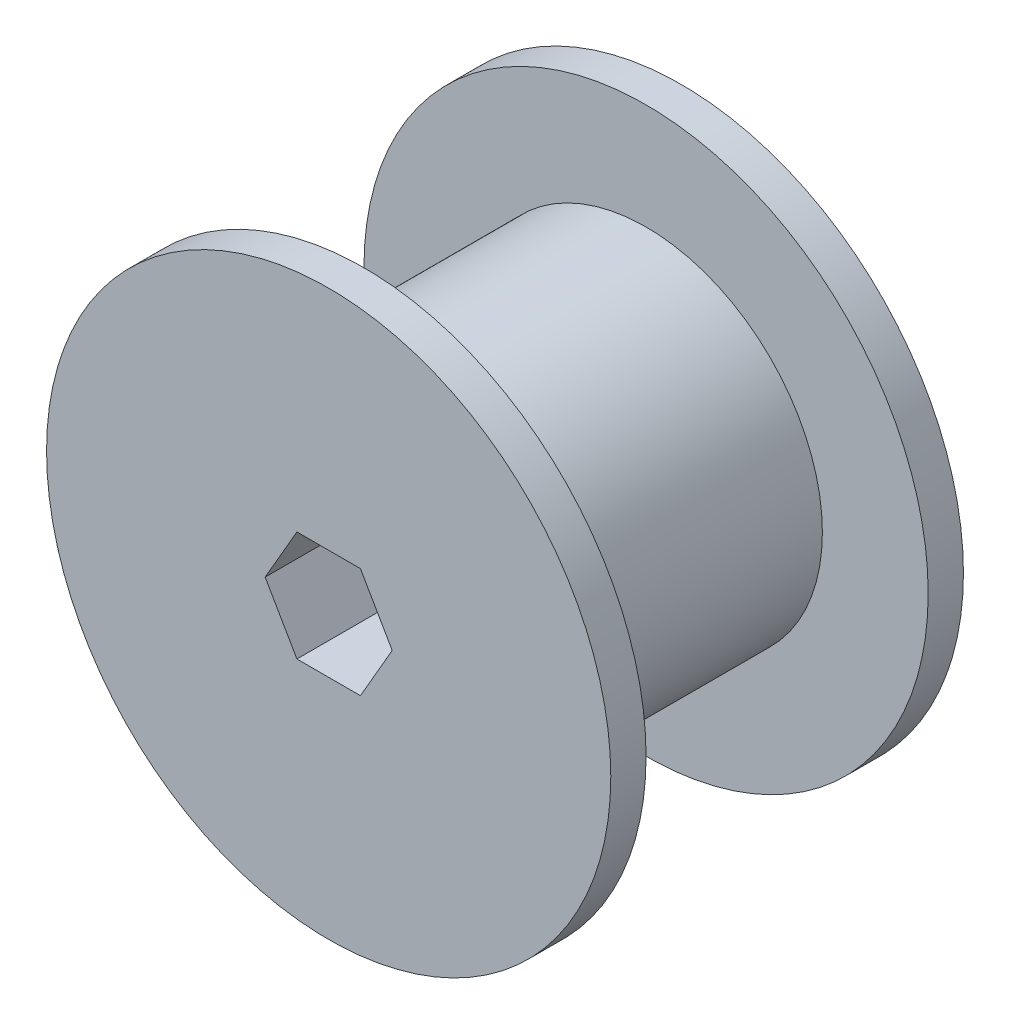
ISO-10303-21;
HEADER;
FILE_DESCRIPTION(('STEP AP214'),'2;1');
FILE_NAME('part.step','',(''),(''),'','','');
FILE_SCHEMA(('AUTOMOTIVE_DESIGN { 1 0 10303 214 1 1 1 1 }'));
ENDSEC;
DATA;
#1=APPLICATION_CONTEXT('core data for automotive mechanical design processes');
#2=APPLICATION_PROTOCOL_DEFINITION('international standard','automotive_design',2000,#1);
#3=PRODUCT_CONTEXT('',#1,'mechanical');
#4=PRODUCT('Part','Part','',(#3));
#5=PRODUCT_RELATED_PRODUCT_CATEGORY('part','',(#4));
#6=PRODUCT_DEFINITION_FORMATION('','',#4);
#7=PRODUCT_DEFINITION_CONTEXT('part definition',#1,'design');
#8=PRODUCT_DEFINITION('design','',#6,#7);
#9=PRODUCT_DEFINITION_SHAPE('','',#8);
#10=(LENGTH_UNIT() NAMED_UNIT(*) SI_UNIT(.MILLI.,.METRE.));
#11=(NAMED_UNIT(*) PLANE_ANGLE_UNIT() SI_UNIT($,.RADIAN.));
#12=(NAMED_UNIT(*) SI_UNIT($,.STERADIAN.) SOLID_ANGLE_UNIT());
#13=UNCERTAINTY_MEASURE_WITH_UNIT(LENGTH_MEASURE(1.E-05),#10,'distance_accuracy_value','');
#14=(GEOMETRIC_REPRESENTATION_CONTEXT(3) GLOBAL_UNCERTAINTY_ASSIGNED_CONTEXT((#13)) GLOBAL_UNIT_ASSIGNED_CONTEXT((#10,
#11,#12)) REPRESENTATION_CONTEXT('',''));
#15=CARTESIAN_POINT('',(0.,0.,0.));
#16=DIRECTION('',(0.,0.,1.));
#17=DIRECTION('',(1.,0.,0.));
#18=AXIS2_PLACEMENT_3D('',#15,#16,#17);
#19=CARTESIAN_POINT('',(0.,0.,12.7));
#20=DIRECTION('',(0.,0.,-1.));
#21=DIRECTION('',(-1.,0.,0.));
#22=AXIS2_PLACEMENT_3D('',#19,#20,#21);
#23=CYLINDRICAL_SURFACE('',#22,15.875);
#24=CARTESIAN_POINT('',(0.,0.,12.7));
#25=DIRECTION('',(0.,0.,1.));
#26=DIRECTION('',(1.,0.,0.));
#27=AXIS2_PLACEMENT_3D('',#24,#25,#26);
#28=CIRCLE('',#27,15.875);
#29=CARTESIAN_POINT('',(15.875,0.,12.7));
#30=VERTEX_POINT('',#29);
#31=EDGE_CURVE('E11',#30,#30,#28,.T.);
#32=ORIENTED_EDGE('',*,*,#31,.F.);
#33=EDGE_LOOP('',(#32));
#34=FACE_BOUND('',#33,.T.);
#35=CARTESIAN_POINT('',(0.,0.,-12.7));
#36=DIRECTION('',(0.,0.,1.));
#37=DIRECTION('',(1.,0.,0.));
#38=AXIS2_PLACEMENT_3D('',#35,#36,#37);
#39=CIRCLE('',#38,15.875);
#40=CARTESIAN_POINT('',(15.875,0.,-12.7));
#41=VERTEX_POINT('',#40);
#42=EDGE_CURVE('E42',#41,#41,#39,.T.);
#43=ORIENTED_EDGE('',*,*,#42,.T.);
#44=EDGE_LOOP('',(#43));
#45=FACE_BOUND('',#44,.T.);
#46=ADVANCED_FACE('F39',(#34,#45),#23,.T.);
#47=CARTESIAN_POINT('',(0.,0.,15.875));
#48=DIRECTION('',(0.,0.,-1.));
#49=DIRECTION('',(-1.,0.,0.));
#50=AXIS2_PLACEMENT_3D('',#47,#48,#49);
#51=CYLINDRICAL_SURFACE('',#50,25.4);
#52=CARTESIAN_POINT('',(0.,0.,15.875));
#53=DIRECTION('',(0.,0.,1.));
#54=DIRECTION('',(1.,0.,0.));
#55=AXIS2_PLACEMENT_3D('',#52,#53,#54);
#56=CIRCLE('',#55,25.4);
#57=CARTESIAN_POINT('',(25.4,0.,15.875));
#58=VERTEX_POINT('',#57);
#59=EDGE_CURVE('E48',#58,#58,#56,.T.);
#60=ORIENTED_EDGE('',*,*,#59,.F.);
#61=EDGE_LOOP('',(#60));
#62=FACE_BOUND('',#61,.T.);
#63=CARTESIAN_POINT('',(0.,0.,12.7));
#64=DIRECTION('',(0.,0.,1.));
#65=DIRECTION('',(1.,0.,0.));
#66=AXIS2_PLACEMENT_3D('',#63,#64,#65);
#67=CIRCLE('',#66,25.4);
#68=CARTESIAN_POINT('',(25.4,0.,12.7));
#69=VERTEX_POINT('',#68);
#70=EDGE_CURVE('E174',#69,#69,#67,.T.);
#71=ORIENTED_EDGE('',*,*,#70,.T.);
#72=EDGE_LOOP('',(#71));
#73=FACE_BOUND('',#72,.T.);
#74=ADVANCED_FACE('F205',(#62,#73),#51,.T.);
#75=CARTESIAN_POINT('',(0.,0.,15.875));
#76=DIRECTION('',(0.,0.,1.));
#77=DIRECTION('',(1.,0.,0.));
#78=AXIS2_PLACEMENT_3D('',#75,#76,#77);
#79=PLANE('',#78);
#80=DIRECTION('',(0.5,0.866025403784439,0.));
#81=VECTOR('',#80,1.);
#82=CARTESIAN_POINT('',(2.85961588329622,-4.953,15.875));
#83=LINE('',#82,#81);
#84=CARTESIAN_POINT('',(2.85961588329622,-4.953,15.875));
#85=VERTEX_POINT('',#84);
#86=CARTESIAN_POINT('',(5.71923176659244,0.,15.875));
#87=VERTEX_POINT('',#86);
#88=EDGE_CURVE('E55',#85,#87,#83,.T.);
#89=ORIENTED_EDGE('',*,*,#88,.F.);
#90=DIRECTION('',(1.,0.,0.));
#91=VECTOR('',#90,1.);
#92=CARTESIAN_POINT('',(-2.85961588329622,-4.953,15.875));
#93=LINE('',#92,#91);
#94=CARTESIAN_POINT('',(-2.85961588329622,-4.953,15.875));
#95=VERTEX_POINT('',#94);
#96=EDGE_CURVE('E115',#95,#85,#93,.T.);
#97=ORIENTED_EDGE('',*,*,#96,.F.);
#98=DIRECTION('',(0.5,-0.866025403784439,0.));
#99=VECTOR('',#98,1.);
#100=CARTESIAN_POINT('',(-5.71923176659244,0.,15.875));
#101=LINE('',#100,#99);
#102=CARTESIAN_POINT('',(-5.71923176659244,0.,15.875));
#103=VERTEX_POINT('',#102);
#104=EDGE_CURVE('E119',#103,#95,#101,.T.);
#105=ORIENTED_EDGE('',*,*,#104,.F.);
#106=DIRECTION('',(-0.5,-0.866025403784439,0.));
#107=VECTOR('',#106,1.);
#108=CARTESIAN_POINT('',(-2.85961588329622,4.953,15.875));
#109=LINE('',#108,#107);
#110=CARTESIAN_POINT('',(-2.85961588329622,4.953,15.875));
#111=VERTEX_POINT('',#110);
#112=EDGE_CURVE('E142',#111,#103,#109,.T.);
#113=ORIENTED_EDGE('',*,*,#112,.F.);
#114=DIRECTION('',(-1.,0.,0.));
#115=VECTOR('',#114,1.);
#116=CARTESIAN_POINT('',(2.85961588329622,4.953,15.875));
#117=LINE('',#116,#115);
#118=CARTESIAN_POINT('',(2.85961588329622,4.953,15.875));
#119=VERTEX_POINT('',#118);
#120=EDGE_CURVE('E138',#119,#111,#117,.T.);
#121=ORIENTED_EDGE('',*,*,#120,.F.);
#122=DIRECTION('',(-0.5,0.866025403784439,0.));
#123=VECTOR('',#122,1.);
#124=CARTESIAN_POINT('',(5.71923176659244,0.,15.875));
#125=LINE('',#124,#123);
#126=EDGE_CURVE('E135',#87,#119,#125,.T.);
#127=ORIENTED_EDGE('',*,*,#126,.F.);
#128=EDGE_LOOP('',(#89,#97,#105,#113,#121,#127));
#129=FACE_BOUND('',#128,.T.);
#130=ORIENTED_EDGE('',*,*,#59,.T.);
#131=EDGE_LOOP('',(#130));
#132=FACE_BOUND('',#131,.T.);
#133=ADVANCED_FACE('F200',(#129,#132),#79,.T.);
#134=CARTESIAN_POINT('',(0.,0.,12.7));
#135=DIRECTION('',(0.,0.,1.));
#136=DIRECTION('',(1.,0.,0.));
#137=AXIS2_PLACEMENT_3D('',#134,#135,#136);
#138=PLANE('',#137);
#139=ORIENTED_EDGE('',*,*,#31,.T.);
#140=EDGE_LOOP('',(#139));
#141=FACE_BOUND('',#140,.T.);
#142=ORIENTED_EDGE('',*,*,#70,.F.);
#143=EDGE_LOOP('',(#142));
#144=FACE_BOUND('',#143,.T.);
#145=ADVANCED_FACE('F192',(#141,#144),#138,.F.);
#146=CARTESIAN_POINT('',(0.,0.,-15.875));
#147=DIRECTION('',(0.,0.,1.));
#148=DIRECTION('',(1.,0.,0.));
#149=AXIS2_PLACEMENT_3D('',#146,#147,#148);
#150=CYLINDRICAL_SURFACE('',#149,25.4);
#151=CARTESIAN_POINT('',(0.,0.,-15.875));
#152=DIRECTION('',(0.,0.,1.));
#153=DIRECTION('',(1.,0.,0.));
#154=AXIS2_PLACEMENT_3D('',#151,#152,#153);
#155=CIRCLE('',#154,25.4);
#156=CARTESIAN_POINT('',(25.4,0.,-15.875));
#157=VERTEX_POINT('',#156);
#158=EDGE_CURVE('E164',#157,#157,#155,.T.);
#159=ORIENTED_EDGE('',*,*,#158,.T.);
#160=EDGE_LOOP('',(#159));
#161=FACE_BOUND('',#160,.T.);
#162=CARTESIAN_POINT('',(0.,0.,-12.7));
#163=DIRECTION('',(0.,0.,1.));
#164=DIRECTION('',(1.,0.,0.));
#165=AXIS2_PLACEMENT_3D('',#162,#163,#164);
#166=CIRCLE('',#165,25.4);
#167=CARTESIAN_POINT('',(25.4,0.,-12.7));
#168=VERTEX_POINT('',#167);
#169=EDGE_CURVE('E152',#168,#168,#166,.T.);
#170=ORIENTED_EDGE('',*,*,#169,.F.);
#171=EDGE_LOOP('',(#170));
#172=FACE_BOUND('',#171,.T.);
#173=ADVANCED_FACE('F190',(#161,#172),#150,.T.);
#174=CARTESIAN_POINT('',(0.,0.,-15.875));
#175=DIRECTION('',(0.,0.,-1.));
#176=DIRECTION('',(1.,0.,0.));
#177=AXIS2_PLACEMENT_3D('',#174,#175,#176);
#178=PLANE('',#177);
#179=DIRECTION('',(0.5,0.866025403784439,0.));
#180=VECTOR('',#179,1.);
#181=CARTESIAN_POINT('',(2.85961588329622,-4.953,-15.875));
#182=LINE('',#181,#180);
#183=CARTESIAN_POINT('',(2.85961588329622,-4.953,-15.875));
#184=VERTEX_POINT('',#183);
#185=CARTESIAN_POINT('',(5.71923176659244,0.,-15.875));
#186=VERTEX_POINT('',#185);
#187=EDGE_CURVE('E95',#184,#186,#182,.T.);
#188=ORIENTED_EDGE('',*,*,#187,.T.);
#189=DIRECTION('',(-0.5,0.866025403784439,0.));
#190=VECTOR('',#189,1.);
#191=CARTESIAN_POINT('',(5.71923176659244,0.,-15.875));
#192=LINE('',#191,#190);
#193=CARTESIAN_POINT('',(2.85961588329622,4.953,-15.875));
#194=VERTEX_POINT('',#193);
#195=EDGE_CURVE('E105',#186,#194,#192,.T.);
#196=ORIENTED_EDGE('',*,*,#195,.T.);
#197=DIRECTION('',(-1.,0.,0.));
#198=VECTOR('',#197,1.);
#199=CARTESIAN_POINT('',(2.85961588329622,4.953,-15.875));
#200=LINE('',#199,#198);
#201=CARTESIAN_POINT('',(-2.85961588329622,4.953,-15.875));
#202=VERTEX_POINT('',#201);
#203=EDGE_CURVE('E63',#194,#202,#200,.T.);
#204=ORIENTED_EDGE('',*,*,#203,.T.);
#205=DIRECTION('',(-0.5,-0.866025403784439,0.));
#206=VECTOR('',#205,1.);
#207=CARTESIAN_POINT('',(-2.85961588329622,4.953,-15.875));
#208=LINE('',#207,#206);
#209=CARTESIAN_POINT('',(-5.71923176659244,0.,-15.875));
#210=VERTEX_POINT('',#209);
#211=EDGE_CURVE('E124',#202,#210,#208,.T.);
#212=ORIENTED_EDGE('',*,*,#211,.T.);
#213=DIRECTION('',(0.5,-0.866025403784439,0.));
#214=VECTOR('',#213,1.);
#215=CARTESIAN_POINT('',(-5.71923176659244,0.,-15.875));
#216=LINE('',#215,#214);
#217=CARTESIAN_POINT('',(-2.85961588329622,-4.953,-15.875));
#218=VERTEX_POINT('',#217);
#219=EDGE_CURVE('E128',#210,#218,#216,.T.);
#220=ORIENTED_EDGE('',*,*,#219,.T.);
#221=DIRECTION('',(1.,0.,0.));
#222=VECTOR('',#221,1.);
#223=CARTESIAN_POINT('',(-2.85961588329622,-4.953,-15.875));
#224=LINE('',#223,#222);
#225=EDGE_CURVE('E102',#218,#184,#224,.T.);
#226=ORIENTED_EDGE('',*,*,#225,.T.);
#227=EDGE_LOOP('',(#188,#196,#204,#212,#220,#226));
#228=FACE_BOUND('',#227,.T.);
#229=ORIENTED_EDGE('',*,*,#158,.F.);
#230=EDGE_LOOP('',(#229));
#231=FACE_BOUND('',#230,.T.);
#232=ADVANCED_FACE('F110',(#228,#231),#178,.T.);
#233=CARTESIAN_POINT('',(0.,0.,-12.7));
#234=DIRECTION('',(0.,0.,-1.));
#235=DIRECTION('',(1.,0.,0.));
#236=AXIS2_PLACEMENT_3D('',#233,#234,#235);
#237=PLANE('',#236);
#238=ORIENTED_EDGE('',*,*,#42,.F.);
#239=EDGE_LOOP('',(#238));
#240=FACE_BOUND('',#239,.T.);
#241=ORIENTED_EDGE('',*,*,#169,.T.);
#242=EDGE_LOOP('',(#241));
#243=FACE_BOUND('',#242,.T.);
#244=ADVANCED_FACE('F184',(#240,#243),#237,.F.);
#245=CARTESIAN_POINT('',(2.85961588329622,-4.953,-15.875));
#246=DIRECTION('',(0.866025403784439,-0.5,0.));
#247=DIRECTION('',(0.5,0.866025403784439,0.));
#248=AXIS2_PLACEMENT_3D('',#245,#246,#247);
#249=PLANE('',#248);
#250=ORIENTED_EDGE('',*,*,#88,.T.);
#251=DIRECTION('',(0.,0.,1.));
#252=VECTOR('',#251,1.);
#253=CARTESIAN_POINT('',(5.71923176659244,0.,-15.875));
#254=LINE('',#253,#252);
#255=EDGE_CURVE('E91',#186,#87,#254,.T.);
#256=ORIENTED_EDGE('',*,*,#255,.F.);
#257=ORIENTED_EDGE('',*,*,#187,.F.);
#258=DIRECTION('',(0.,0.,1.));
#259=VECTOR('',#258,1.);
#260=CARTESIAN_POINT('',(2.85961588329622,-4.953,-15.875));
#261=LINE('',#260,#259);
#262=EDGE_CURVE('E149',#184,#85,#261,.T.);
#263=ORIENTED_EDGE('',*,*,#262,.T.);
#264=EDGE_LOOP('',(#250,#256,#257,#263));
#265=FACE_BOUND('',#264,.T.);
#266=ADVANCED_FACE('F93',(#265),#249,.F.);
#267=CARTESIAN_POINT('',(-2.85961588329622,-4.953,-15.875));
#268=DIRECTION('',(0.,-1.,0.));
#269=DIRECTION('',(0.,0.,-1.));
#270=AXIS2_PLACEMENT_3D('',#267,#268,#269);
#271=PLANE('',#270);
#272=ORIENTED_EDGE('',*,*,#96,.T.);
#273=ORIENTED_EDGE('',*,*,#262,.F.);
#274=ORIENTED_EDGE('',*,*,#225,.F.);
#275=DIRECTION('',(0.,0.,1.));
#276=VECTOR('',#275,1.);
#277=CARTESIAN_POINT('',(-2.85961588329622,-4.953,-15.875));
#278=LINE('',#277,#276);
#279=EDGE_CURVE('E153',#218,#95,#278,.T.);
#280=ORIENTED_EDGE('',*,*,#279,.T.);
#281=EDGE_LOOP('',(#272,#273,#274,#280));
#282=FACE_BOUND('',#281,.T.);
#283=ADVANCED_FACE('F233',(#282),#271,.F.);
#284=CARTESIAN_POINT('',(-5.71923176659244,0.,-15.875));
#285=DIRECTION('',(-0.866025403784439,-0.5,0.));
#286=DIRECTION('',(0.5,-0.866025403784439,0.));
#287=AXIS2_PLACEMENT_3D('',#284,#285,#286);
#288=PLANE('',#287);
#289=ORIENTED_EDGE('',*,*,#104,.T.);
#290=ORIENTED_EDGE('',*,*,#279,.F.);
#291=ORIENTED_EDGE('',*,*,#219,.F.);
#292=DIRECTION('',(0.,0.,1.));
#293=VECTOR('',#292,1.);
#294=CARTESIAN_POINT('',(-5.71923176659244,0.,-15.875));
#295=LINE('',#294,#293);
#296=EDGE_CURVE('E156',#210,#103,#295,.T.);
#297=ORIENTED_EDGE('',*,*,#296,.T.);
#298=EDGE_LOOP('',(#289,#290,#291,#297));
#299=FACE_BOUND('',#298,.T.);
#300=ADVANCED_FACE('F231',(#299),#288,.F.);
#301=CARTESIAN_POINT('',(-2.85961588329622,4.953,-15.875));
#302=DIRECTION('',(-0.866025403784439,0.5,0.));
#303=DIRECTION('',(-0.5,-0.866025403784439,0.));
#304=AXIS2_PLACEMENT_3D('',#301,#302,#303);
#305=PLANE('',#304);
#306=ORIENTED_EDGE('',*,*,#112,.T.);
#307=ORIENTED_EDGE('',*,*,#296,.F.);
#308=ORIENTED_EDGE('',*,*,#211,.F.);
#309=DIRECTION('',(0.,0.,1.));
#310=VECTOR('',#309,1.);
#311=CARTESIAN_POINT('',(-2.85961588329622,4.953,-15.875));
#312=LINE('',#311,#310);
#313=EDGE_CURVE('E159',#202,#111,#312,.T.);
#314=ORIENTED_EDGE('',*,*,#313,.T.);
#315=EDGE_LOOP('',(#306,#307,#308,#314));
#316=FACE_BOUND('',#315,.T.);
#317=ADVANCED_FACE('F228',(#316),#305,.F.);
#318=CARTESIAN_POINT('',(2.85961588329622,4.953,-15.875));
#319=DIRECTION('',(0.,1.,0.));
#320=DIRECTION('',(-1.,0.,0.));
#321=AXIS2_PLACEMENT_3D('',#318,#319,#320);
#322=PLANE('',#321);
#323=ORIENTED_EDGE('',*,*,#120,.T.);
#324=ORIENTED_EDGE('',*,*,#313,.F.);
#325=ORIENTED_EDGE('',*,*,#203,.F.);
#326=DIRECTION('',(0.,0.,1.));
#327=VECTOR('',#326,1.);
#328=CARTESIAN_POINT('',(2.85961588329622,4.953,-15.875));
#329=LINE('',#328,#327);
#330=EDGE_CURVE('E101',#194,#119,#329,.T.);
#331=ORIENTED_EDGE('',*,*,#330,.T.);
#332=EDGE_LOOP('',(#323,#324,#325,#331));
#333=FACE_BOUND('',#332,.T.);
#334=ADVANCED_FACE('F225',(#333),#322,.F.);
#335=CARTESIAN_POINT('',(5.71923176659244,0.,-15.875));
#336=DIRECTION('',(0.866025403784439,0.5,0.));
#337=DIRECTION('',(-0.5,0.866025403784439,0.));
#338=AXIS2_PLACEMENT_3D('',#335,#336,#337);
#339=PLANE('',#338);
#340=ORIENTED_EDGE('',*,*,#126,.T.);
#341=ORIENTED_EDGE('',*,*,#330,.F.);
#342=ORIENTED_EDGE('',*,*,#195,.F.);
#343=ORIENTED_EDGE('',*,*,#255,.T.);
#344=EDGE_LOOP('',(#340,#341,#342,#343));
#345=FACE_BOUND('',#344,.T.);
#346=ADVANCED_FACE('F106',(#345),#339,.F.);
#347=CLOSED_SHELL('',(#46,#74,#133,#145,#173,#232,#244,#266,#283,#300,#317,#334,#346));
#348=MANIFOLD_SOLID_BREP('B2',#347);
#349=ADVANCED_BREP_SHAPE_REPRESENTATION('',(#18,#348),#14);
#350=SHAPE_DEFINITION_REPRESENTATION(#9,#349);
ENDSEC;
END-ISO-10303-21;
